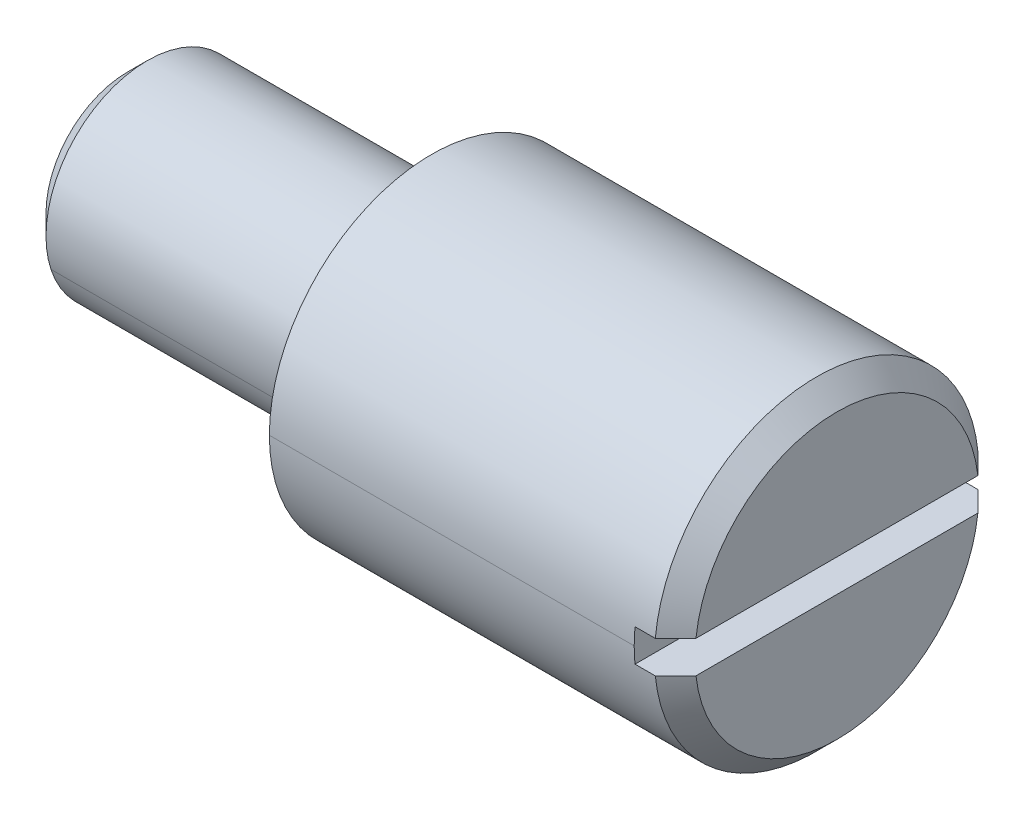
ISO-10303-21;
HEADER;
FILE_DESCRIPTION(('STEP AP214'),'2;1');
FILE_NAME('part.step','',(''),(''),'','','');
FILE_SCHEMA(('AUTOMOTIVE_DESIGN { 1 0 10303 214 1 1 1 1 }'));
ENDSEC;
DATA;
#1=APPLICATION_CONTEXT('core data for automotive mechanical design processes');
#2=APPLICATION_PROTOCOL_DEFINITION('international standard','automotive_design',2000,#1);
#3=PRODUCT_CONTEXT('',#1,'mechanical');
#4=PRODUCT('Part','Part','',(#3));
#5=PRODUCT_RELATED_PRODUCT_CATEGORY('part','',(#4));
#6=PRODUCT_DEFINITION_FORMATION('','',#4);
#7=PRODUCT_DEFINITION_CONTEXT('part definition',#1,'design');
#8=PRODUCT_DEFINITION('design','',#6,#7);
#9=PRODUCT_DEFINITION_SHAPE('','',#8);
#10=(LENGTH_UNIT() NAMED_UNIT(*) SI_UNIT(.MILLI.,.METRE.));
#11=(NAMED_UNIT(*) PLANE_ANGLE_UNIT() SI_UNIT($,.RADIAN.));
#12=(NAMED_UNIT(*) SI_UNIT($,.STERADIAN.) SOLID_ANGLE_UNIT());
#13=UNCERTAINTY_MEASURE_WITH_UNIT(LENGTH_MEASURE(1.E-05),#10,'distance_accuracy_value','');
#14=(GEOMETRIC_REPRESENTATION_CONTEXT(3) GLOBAL_UNCERTAINTY_ASSIGNED_CONTEXT((#13)) GLOBAL_UNIT_ASSIGNED_CONTEXT((#10,
#11,#12)) REPRESENTATION_CONTEXT('',''));
#15=CARTESIAN_POINT('',(0.,0.,0.));
#16=DIRECTION('',(0.,0.,1.));
#17=DIRECTION('',(1.,0.,0.));
#18=AXIS2_PLACEMENT_3D('',#15,#16,#17);
#19=CARTESIAN_POINT('',(10.,0.,0.));
#20=DIRECTION('',(1.,0.,0.));
#21=DIRECTION('',(0.,1.,0.));
#22=AXIS2_PLACEMENT_3D('',#19,#20,#21);
#23=CYLINDRICAL_SURFACE('',#22,4.);
#24=DIRECTION('',(1.,0.,0.));
#25=VECTOR('',#24,1.);
#26=CARTESIAN_POINT('',(0.,0.,4.));
#27=LINE('',#26,#25);
#28=CARTESIAN_POINT('',(0.,0.,4.));
#29=VERTEX_POINT('',#28);
#30=CARTESIAN_POINT('',(9.,0.,4.));
#31=VERTEX_POINT('',#30);
#32=EDGE_CURVE('E10',#29,#31,#27,.T.);
#33=ORIENTED_EDGE('',*,*,#32,.F.);
#34=CARTESIAN_POINT('',(0.,0.,0.));
#35=DIRECTION('',(1.,0.,0.));
#36=DIRECTION('',(0.,0.,-1.));
#37=AXIS2_PLACEMENT_3D('',#34,#35,#36);
#38=CIRCLE('',#37,4.);
#39=CARTESIAN_POINT('',(0.,0.,-4.));
#40=VERTEX_POINT('',#39);
#41=EDGE_CURVE('E24',#29,#40,#38,.T.);
#42=ORIENTED_EDGE('',*,*,#41,.T.);
#43=DIRECTION('',(1.,0.,0.));
#44=VECTOR('',#43,1.);
#45=CARTESIAN_POINT('',(0.,0.,-4.));
#46=LINE('',#45,#44);
#47=CARTESIAN_POINT('',(9.,0.,-4.));
#48=VERTEX_POINT('',#47);
#49=EDGE_CURVE('E420',#40,#48,#46,.T.);
#50=ORIENTED_EDGE('',*,*,#49,.T.);
#51=CARTESIAN_POINT('',(9.,0.,0.));
#52=DIRECTION('',(1.,0.,0.));
#53=DIRECTION('',(0.,0.,-1.));
#54=AXIS2_PLACEMENT_3D('',#51,#52,#53);
#55=CIRCLE('',#54,4.);
#56=CARTESIAN_POINT('',(9.,-0.4,-3.97994974842648));
#57=VERTEX_POINT('',#56);
#58=EDGE_CURVE('E415',#57,#48,#55,.T.);
#59=ORIENTED_EDGE('',*,*,#58,.F.);
#60=DIRECTION('',(-1.,0.,0.));
#61=VECTOR('',#60,1.);
#62=CARTESIAN_POINT('',(10.,-0.4,-3.97994974842648));
#63=LINE('',#62,#61);
#64=CARTESIAN_POINT('',(9.5,-0.4,-3.97994974842648));
#65=VERTEX_POINT('',#64);
#66=EDGE_CURVE('E411',#65,#57,#63,.T.);
#67=ORIENTED_EDGE('',*,*,#66,.F.);
#68=CARTESIAN_POINT('',(9.5,0.,0.));
#69=DIRECTION('',(1.,0.,0.));
#70=DIRECTION('',(0.,0.,-1.));
#71=AXIS2_PLACEMENT_3D('',#68,#69,#70);
#72=CIRCLE('',#71,4.);
#73=CARTESIAN_POINT('',(9.5,-0.4,3.97994974842648));
#74=VERTEX_POINT('',#73);
#75=EDGE_CURVE('E143',#74,#65,#72,.T.);
#76=ORIENTED_EDGE('',*,*,#75,.F.);
#77=DIRECTION('',(1.,0.,0.));
#78=VECTOR('',#77,1.);
#79=CARTESIAN_POINT('',(10.,-0.4,3.97994974842648));
#80=LINE('',#79,#78);
#81=CARTESIAN_POINT('',(9.,-0.4,3.97994974842648));
#82=VERTEX_POINT('',#81);
#83=EDGE_CURVE('E404',#82,#74,#80,.T.);
#84=ORIENTED_EDGE('',*,*,#83,.F.);
#85=CARTESIAN_POINT('',(9.,0.,0.));
#86=DIRECTION('',(1.,0.,0.));
#87=DIRECTION('',(0.,0.,-1.));
#88=AXIS2_PLACEMENT_3D('',#85,#86,#87);
#89=CIRCLE('',#88,4.);
#90=EDGE_CURVE('E399',#31,#82,#89,.T.);
#91=ORIENTED_EDGE('',*,*,#90,.F.);
#92=EDGE_LOOP('',(#33,#42,#50,#59,#67,#76,#84,#91));
#93=FACE_BOUND('',#92,.T.);
#94=ADVANCED_FACE('F16',(#93),#23,.T.);
#95=CARTESIAN_POINT('',(9.,0.4,8.));
#96=DIRECTION('',(1.,0.,0.));
#97=DIRECTION('',(0.,0.,-1.));
#98=AXIS2_PLACEMENT_3D('',#95,#96,#97);
#99=PLANE('',#98);
#100=CARTESIAN_POINT('',(9.,0.,0.));
#101=DIRECTION('',(1.,0.,0.));
#102=DIRECTION('',(0.,0.,-1.));
#103=AXIS2_PLACEMENT_3D('',#100,#101,#102);
#104=CIRCLE('',#103,4.);
#105=CARTESIAN_POINT('',(9.,0.4,3.97994974842648));
#106=VERTEX_POINT('',#105);
#107=EDGE_CURVE('E394',#106,#31,#104,.T.);
#108=ORIENTED_EDGE('',*,*,#107,.T.);
#109=ORIENTED_EDGE('',*,*,#90,.T.);
#110=DIRECTION('',(0.,0.,-1.));
#111=VECTOR('',#110,1.);
#112=CARTESIAN_POINT('',(9.,-0.4,8.));
#113=LINE('',#112,#111);
#114=EDGE_CURVE('E389',#82,#57,#113,.T.);
#115=ORIENTED_EDGE('',*,*,#114,.T.);
#116=ORIENTED_EDGE('',*,*,#58,.T.);
#117=CARTESIAN_POINT('',(9.,0.,0.));
#118=DIRECTION('',(1.,0.,0.));
#119=DIRECTION('',(0.,0.,-1.));
#120=AXIS2_PLACEMENT_3D('',#117,#118,#119);
#121=CIRCLE('',#120,4.);
#122=CARTESIAN_POINT('',(9.,0.4,-3.97994974842648));
#123=VERTEX_POINT('',#122);
#124=EDGE_CURVE('E385',#48,#123,#121,.T.);
#125=ORIENTED_EDGE('',*,*,#124,.T.);
#126=DIRECTION('',(0.,0.,-1.));
#127=VECTOR('',#126,1.);
#128=CARTESIAN_POINT('',(9.,0.4,8.));
#129=LINE('',#128,#127);
#130=EDGE_CURVE('E380',#106,#123,#129,.T.);
#131=ORIENTED_EDGE('',*,*,#130,.F.);
#132=EDGE_LOOP('',(#108,#109,#115,#116,#125,#131));
#133=FACE_BOUND('',#132,.T.);
#134=ADVANCED_FACE('F360',(#133),#99,.T.);
#135=CARTESIAN_POINT('',(10.,0.4,8.));
#136=DIRECTION('',(0.,-1.,0.));
#137=DIRECTION('',(0.,0.,-1.));
#138=AXIS2_PLACEMENT_3D('',#135,#136,#137);
#139=PLANE('',#138);
#140=DIRECTION('',(1.,0.,0.));
#141=VECTOR('',#140,1.);
#142=CARTESIAN_POINT('',(10.,0.4,-3.97994974842648));
#143=LINE('',#142,#141);
#144=CARTESIAN_POINT('',(9.5,0.4,-3.97994974842648));
#145=VERTEX_POINT('',#144);
#146=EDGE_CURVE('E378',#123,#145,#143,.T.);
#147=ORIENTED_EDGE('',*,*,#146,.T.);
#148=CARTESIAN_POINT('',(9.5,0.4,-3.97994974842648));
#149=CARTESIAN_POINT('',(9.66672719356399,0.4,-3.81238261406263));
#150=CARTESIAN_POINT('',(9.83340259039216,0.4,-3.64476389797192));
#151=CARTESIAN_POINT('',(10.,0.4,-3.47706773014273));
#152=B_SPLINE_CURVE_WITH_KNOTS('',3,(#148,#149,#150,#151),.UNSPECIFIED.,.F.,.F.,(4,4),(0.,1.),.UNSPECIFIED.);
#153=CARTESIAN_POINT('',(10.,0.4,-3.47706773014274));
#154=VERTEX_POINT('',#153);
#155=EDGE_CURVE('E376',#145,#154,#152,.T.);
#156=ORIENTED_EDGE('',*,*,#155,.T.);
#157=DIRECTION('',(0.,0.,1.));
#158=VECTOR('',#157,1.);
#159=CARTESIAN_POINT('',(10.,0.4,0.));
#160=LINE('',#159,#158);
#161=CARTESIAN_POINT('',(10.,0.4,3.47706773014274));
#162=VERTEX_POINT('',#161);
#163=EDGE_CURVE('E688',#154,#162,#160,.T.);
#164=ORIENTED_EDGE('',*,*,#163,.T.);
#165=CARTESIAN_POINT('',(10.,0.4,3.47706773014274));
#166=CARTESIAN_POINT('',(9.8334028568546,0.4,3.64476362975208));
#167=CARTESIAN_POINT('',(9.66672692689396,0.4,3.81238288207609));
#168=CARTESIAN_POINT('',(9.5,0.4,3.97994974842648));
#169=B_SPLINE_CURVE_WITH_KNOTS('',3,(#165,#166,#167,#168),.UNSPECIFIED.,.F.,.F.,(4,4),(0.,1.),.UNSPECIFIED.);
#170=CARTESIAN_POINT('',(9.5,0.4,3.97994974842648));
#171=VERTEX_POINT('',#170);
#172=EDGE_CURVE('E221',#162,#171,#169,.T.);
#173=ORIENTED_EDGE('',*,*,#172,.T.);
#174=DIRECTION('',(-1.,0.,0.));
#175=VECTOR('',#174,1.);
#176=CARTESIAN_POINT('',(10.,0.4,3.97994974842648));
#177=LINE('',#176,#175);
#178=EDGE_CURVE('E338',#171,#106,#177,.T.);
#179=ORIENTED_EDGE('',*,*,#178,.T.);
#180=ORIENTED_EDGE('',*,*,#130,.T.);
#181=EDGE_LOOP('',(#147,#156,#164,#173,#179,#180));
#182=FACE_BOUND('',#181,.T.);
#183=ADVANCED_FACE('F350',(#182),#139,.T.);
#184=CARTESIAN_POINT('',(10.,0.,0.));
#185=DIRECTION('',(1.,0.,0.));
#186=DIRECTION('',(0.,-1.,0.));
#187=AXIS2_PLACEMENT_3D('',#184,#185,#186);
#188=CYLINDRICAL_SURFACE('',#187,4.);
#189=ORIENTED_EDGE('',*,*,#32,.T.);
#190=ORIENTED_EDGE('',*,*,#107,.F.);
#191=ORIENTED_EDGE('',*,*,#178,.F.);
#192=CARTESIAN_POINT('',(9.5,0.,0.));
#193=DIRECTION('',(1.,0.,0.));
#194=DIRECTION('',(0.,0.,-1.));
#195=AXIS2_PLACEMENT_3D('',#192,#193,#194);
#196=CIRCLE('',#195,4.);
#197=EDGE_CURVE('E334',#145,#171,#196,.T.);
#198=ORIENTED_EDGE('',*,*,#197,.F.);
#199=ORIENTED_EDGE('',*,*,#146,.F.);
#200=ORIENTED_EDGE('',*,*,#124,.F.);
#201=ORIENTED_EDGE('',*,*,#49,.F.);
#202=CARTESIAN_POINT('',(0.,0.,0.));
#203=DIRECTION('',(1.,0.,0.));
#204=DIRECTION('',(0.,0.,-1.));
#205=AXIS2_PLACEMENT_3D('',#202,#203,#204);
#206=CIRCLE('',#205,4.);
#207=EDGE_CURVE('E330',#40,#29,#206,.T.);
#208=ORIENTED_EDGE('',*,*,#207,.T.);
#209=EDGE_LOOP('',(#189,#190,#191,#198,#199,#200,#201,#208));
#210=FACE_BOUND('',#209,.T.);
#211=ADVANCED_FACE('F359',(#210),#188,.T.);
#212=CARTESIAN_POINT('',(0.,0.,0.));
#213=DIRECTION('',(1.,0.,0.));
#214=DIRECTION('',(0.,0.,-1.));
#215=AXIS2_PLACEMENT_3D('',#212,#213,#214);
#216=PLANE('',#215);
#217=ORIENTED_EDGE('',*,*,#41,.F.);
#218=ORIENTED_EDGE('',*,*,#207,.F.);
#219=EDGE_LOOP('',(#217,#218));
#220=FACE_BOUND('',#219,.T.);
#221=CARTESIAN_POINT('',(0.,0.,0.));
#222=DIRECTION('',(1.,0.,0.));
#223=DIRECTION('',(0.,0.,-1.));
#224=AXIS2_PLACEMENT_3D('',#221,#222,#223);
#225=CIRCLE('',#224,2.0095);
#226=CARTESIAN_POINT('',(0.,0.,-2.0095));
#227=VERTEX_POINT('',#226);
#228=CARTESIAN_POINT('',(0.,0.,2.0095));
#229=VERTEX_POINT('',#228);
#230=EDGE_CURVE('E326',#227,#229,#225,.T.);
#231=ORIENTED_EDGE('',*,*,#230,.T.);
#232=CARTESIAN_POINT('',(0.,0.,0.));
#233=DIRECTION('',(1.,0.,0.));
#234=DIRECTION('',(0.,0.,-1.));
#235=AXIS2_PLACEMENT_3D('',#232,#233,#234);
#236=CIRCLE('',#235,2.0095);
#237=EDGE_CURVE('E322',#229,#227,#236,.T.);
#238=ORIENTED_EDGE('',*,*,#237,.T.);
#239=EDGE_LOOP('',(#231,#238));
#240=FACE_BOUND('',#239,.T.);
#241=ADVANCED_FACE('F438',(#220,#240),#216,.F.);
#242=CARTESIAN_POINT('',(0.,0.,0.));
#243=DIRECTION('',(1.,0.,0.));
#244=DIRECTION('',(0.,1.,0.));
#245=AXIS2_PLACEMENT_3D('',#242,#243,#244);
#246=CYLINDRICAL_SURFACE('',#245,2.0095);
#247=DIRECTION('',(1.,0.,0.));
#248=VECTOR('',#247,1.);
#249=CARTESIAN_POINT('',(-0.5,0.,2.0095));
#250=LINE('',#249,#248);
#251=CARTESIAN_POINT('',(-0.5,0.,2.0095));
#252=VERTEX_POINT('',#251);
#253=EDGE_CURVE('E317',#252,#229,#250,.T.);
#254=ORIENTED_EDGE('',*,*,#253,.F.);
#255=CARTESIAN_POINT('',(-0.5,0.,0.));
#256=DIRECTION('',(1.,0.,0.));
#257=DIRECTION('',(0.,0.,-1.));
#258=AXIS2_PLACEMENT_3D('',#255,#256,#257);
#259=CIRCLE('',#258,2.0095);
#260=CARTESIAN_POINT('',(-0.5,0.,-2.0095));
#261=VERTEX_POINT('',#260);
#262=EDGE_CURVE('E313',#252,#261,#259,.T.);
#263=ORIENTED_EDGE('',*,*,#262,.T.);
#264=DIRECTION('',(1.,0.,0.));
#265=VECTOR('',#264,1.);
#266=CARTESIAN_POINT('',(-0.5,0.,-2.0095));
#267=LINE('',#266,#265);
#268=EDGE_CURVE('E308',#261,#227,#267,.T.);
#269=ORIENTED_EDGE('',*,*,#268,.T.);
#270=ORIENTED_EDGE('',*,*,#237,.F.);
#271=EDGE_LOOP('',(#254,#263,#269,#270));
#272=FACE_BOUND('',#271,.T.);
#273=ADVANCED_FACE('F441',(#272),#246,.T.);
#274=CARTESIAN_POINT('',(0.,0.,0.));
#275=DIRECTION('',(1.,0.,0.));
#276=DIRECTION('',(0.,-1.,0.));
#277=AXIS2_PLACEMENT_3D('',#274,#275,#276);
#278=CYLINDRICAL_SURFACE('',#277,2.0095);
#279=ORIENTED_EDGE('',*,*,#253,.T.);
#280=ORIENTED_EDGE('',*,*,#230,.F.);
#281=ORIENTED_EDGE('',*,*,#268,.F.);
#282=CARTESIAN_POINT('',(-0.5,0.,0.));
#283=DIRECTION('',(1.,0.,0.));
#284=DIRECTION('',(0.,0.,-1.));
#285=AXIS2_PLACEMENT_3D('',#282,#283,#284);
#286=CIRCLE('',#285,2.0095);
#287=EDGE_CURVE('E303',#261,#252,#286,.T.);
#288=ORIENTED_EDGE('',*,*,#287,.T.);
#289=EDGE_LOOP('',(#279,#280,#281,#288));
#290=FACE_BOUND('',#289,.T.);
#291=ADVANCED_FACE('F447',(#290),#278,.T.);
#292=CARTESIAN_POINT('',(-0.9905,0.,0.));
#293=DIRECTION('',(-1.,0.,0.));
#294=DIRECTION('',(0.,-1.,0.));
#295=AXIS2_PLACEMENT_3D('',#292,#293,#294);
#296=CONICAL_SURFACE('',#295,2.5,0.785398163397448);
#297=DIRECTION('',(-0.707106781186548,0.,-0.707106781186547));
#298=VECTOR('',#297,1.);
#299=CARTESIAN_POINT('',(-0.5,0.,-2.0095));
#300=LINE('',#299,#298);
#301=CARTESIAN_POINT('',(-0.9905,0.,-2.5));
#302=VERTEX_POINT('',#301);
#303=EDGE_CURVE('E299',#261,#302,#300,.T.);
#304=ORIENTED_EDGE('',*,*,#303,.T.);
#305=CARTESIAN_POINT('',(-0.9905,0.,0.));
#306=DIRECTION('',(1.,0.,0.));
#307=DIRECTION('',(0.,0.,-1.));
#308=AXIS2_PLACEMENT_3D('',#305,#306,#307);
#309=CIRCLE('',#308,2.5);
#310=CARTESIAN_POINT('',(-0.9905,0.,2.5));
#311=VERTEX_POINT('',#310);
#312=EDGE_CURVE('E295',#302,#311,#309,.T.);
#313=ORIENTED_EDGE('',*,*,#312,.T.);
#314=DIRECTION('',(-0.707106781186548,0.,0.707106781186547));
#315=VECTOR('',#314,1.);
#316=CARTESIAN_POINT('',(-0.5,0.,2.0095));
#317=LINE('',#316,#315);
#318=EDGE_CURVE('E290',#252,#311,#317,.T.);
#319=ORIENTED_EDGE('',*,*,#318,.F.);
#320=ORIENTED_EDGE('',*,*,#287,.F.);
#321=EDGE_LOOP('',(#304,#313,#319,#320));
#322=FACE_BOUND('',#321,.T.);
#323=ADVANCED_FACE('F452',(#322),#296,.T.);
#324=CARTESIAN_POINT('',(-0.9905,0.,0.));
#325=DIRECTION('',(-1.,0.,0.));
#326=DIRECTION('',(0.,1.,0.));
#327=AXIS2_PLACEMENT_3D('',#324,#325,#326);
#328=CONICAL_SURFACE('',#327,2.5,0.785398163397448);
#329=ORIENTED_EDGE('',*,*,#303,.F.);
#330=ORIENTED_EDGE('',*,*,#262,.F.);
#331=ORIENTED_EDGE('',*,*,#318,.T.);
#332=CARTESIAN_POINT('',(-0.9905,0.,0.));
#333=DIRECTION('',(1.,0.,0.));
#334=DIRECTION('',(0.,0.,-1.));
#335=AXIS2_PLACEMENT_3D('',#332,#333,#334);
#336=CIRCLE('',#335,2.5);
#337=CARTESIAN_POINT('',(-0.990500000000001,-0.772542485937367,2.37764129073788));
#338=VERTEX_POINT('',#337);
#339=EDGE_CURVE('E286',#311,#338,#336,.T.);
#340=ORIENTED_EDGE('',*,*,#339,.T.);
#341=CARTESIAN_POINT('',(-0.9905,0.,0.));
#342=DIRECTION('',(1.,0.,0.));
#343=DIRECTION('',(0.,0.,-1.));
#344=AXIS2_PLACEMENT_3D('',#341,#342,#343);
#345=CIRCLE('',#344,2.5);
#346=EDGE_CURVE('E281',#338,#302,#345,.T.);
#347=ORIENTED_EDGE('',*,*,#346,.T.);
#348=EDGE_LOOP('',(#329,#330,#331,#340,#347));
#349=FACE_BOUND('',#348,.T.);
#350=ADVANCED_FACE('F457',(#349),#328,.T.);
#351=CARTESIAN_POINT('',(0.,0.,0.));
#352=DIRECTION('',(1.,0.,0.));
#353=DIRECTION('',(0.,0.987688340595138,0.156434465040231));
#354=AXIS2_PLACEMENT_3D('',#351,#352,#353);
#355=CYLINDRICAL_SURFACE('',#354,2.5);
#356=DIRECTION('',(1.,0.,0.));
#357=VECTOR('',#356,1.);
#358=CARTESIAN_POINT('',(-7.0095,-0.772542485937367,2.37764129073788));
#359=LINE('',#358,#357);
#360=CARTESIAN_POINT('',(-7.0095,-0.772542485937367,2.37764129073788));
#361=VERTEX_POINT('',#360);
#362=EDGE_CURVE('E276',#361,#338,#359,.T.);
#363=ORIENTED_EDGE('',*,*,#362,.F.);
#364=CARTESIAN_POINT('',(-7.0095,0.,0.));
#365=DIRECTION('',(1.,0.,0.));
#366=DIRECTION('',(0.,0.,-1.));
#367=AXIS2_PLACEMENT_3D('',#364,#365,#366);
#368=CIRCLE('',#367,2.5);
#369=CARTESIAN_POINT('',(-7.0095,0.,-2.5));
#370=VERTEX_POINT('',#369);
#371=EDGE_CURVE('E272',#361,#370,#368,.T.);
#372=ORIENTED_EDGE('',*,*,#371,.T.);
#373=DIRECTION('',(1.,0.,0.));
#374=VECTOR('',#373,1.);
#375=CARTESIAN_POINT('',(-7.0095,0.,-2.5));
#376=LINE('',#375,#374);
#377=EDGE_CURVE('E267',#370,#302,#376,.T.);
#378=ORIENTED_EDGE('',*,*,#377,.T.);
#379=ORIENTED_EDGE('',*,*,#346,.F.);
#380=EDGE_LOOP('',(#363,#372,#378,#379));
#381=FACE_BOUND('',#380,.T.);
#382=ADVANCED_FACE('F461',(#381),#355,.T.);
#383=CARTESIAN_POINT('',(0.,0.,0.));
#384=DIRECTION('',(1.,0.,0.));
#385=DIRECTION('',(0.,-0.987688340595138,-0.156434465040231));
#386=AXIS2_PLACEMENT_3D('',#383,#384,#385);
#387=CYLINDRICAL_SURFACE('',#386,2.5);
#388=ORIENTED_EDGE('',*,*,#362,.T.);
#389=ORIENTED_EDGE('',*,*,#339,.F.);
#390=ORIENTED_EDGE('',*,*,#312,.F.);
#391=ORIENTED_EDGE('',*,*,#377,.F.);
#392=CARTESIAN_POINT('',(-7.0095,0.,0.));
#393=DIRECTION('',(1.,0.,0.));
#394=DIRECTION('',(0.,0.,-1.));
#395=AXIS2_PLACEMENT_3D('',#392,#393,#394);
#396=CIRCLE('',#395,2.5);
#397=CARTESIAN_POINT('',(-7.0095,0.,2.5));
#398=VERTEX_POINT('',#397);
#399=EDGE_CURVE('E263',#370,#398,#396,.T.);
#400=ORIENTED_EDGE('',*,*,#399,.T.);
#401=CARTESIAN_POINT('',(-7.0095,0.,0.));
#402=DIRECTION('',(1.,0.,0.));
#403=DIRECTION('',(0.,0.,-1.));
#404=AXIS2_PLACEMENT_3D('',#401,#402,#403);
#405=CIRCLE('',#404,2.5);
#406=EDGE_CURVE('E258',#398,#361,#405,.T.);
#407=ORIENTED_EDGE('',*,*,#406,.T.);
#408=EDGE_LOOP('',(#388,#389,#390,#391,#400,#407));
#409=FACE_BOUND('',#408,.T.);
#410=ADVANCED_FACE('F464',(#409),#387,.T.);
#411=CARTESIAN_POINT('',(-7.5,0.,0.));
#412=DIRECTION('',(1.,0.,0.));
#413=DIRECTION('',(0.,1.,0.));
#414=AXIS2_PLACEMENT_3D('',#411,#412,#413);
#415=CONICAL_SURFACE('',#414,2.0095,0.785398163397449);
#416=DIRECTION('',(0.707106781186547,0.,0.707106781186548));
#417=VECTOR('',#416,1.);
#418=CARTESIAN_POINT('',(-7.5,0.,2.0095));
#419=LINE('',#418,#417);
#420=CARTESIAN_POINT('',(-7.5,0.,2.0095));
#421=VERTEX_POINT('',#420);
#422=EDGE_CURVE('E253',#421,#398,#419,.T.);
#423=ORIENTED_EDGE('',*,*,#422,.F.);
#424=CARTESIAN_POINT('',(-7.5,0.,0.));
#425=DIRECTION('',(1.,0.,0.));
#426=DIRECTION('',(0.,0.,-1.));
#427=AXIS2_PLACEMENT_3D('',#424,#425,#426);
#428=CIRCLE('',#427,2.0095);
#429=CARTESIAN_POINT('',(-7.5,0.,-2.0095));
#430=VERTEX_POINT('',#429);
#431=EDGE_CURVE('E249',#421,#430,#428,.T.);
#432=ORIENTED_EDGE('',*,*,#431,.T.);
#433=DIRECTION('',(0.707106781186547,0.,-0.707106781186548));
#434=VECTOR('',#433,1.);
#435=CARTESIAN_POINT('',(-7.5,0.,-2.0095));
#436=LINE('',#435,#434);
#437=EDGE_CURVE('E244',#430,#370,#436,.T.);
#438=ORIENTED_EDGE('',*,*,#437,.T.);
#439=ORIENTED_EDGE('',*,*,#371,.F.);
#440=ORIENTED_EDGE('',*,*,#406,.F.);
#441=EDGE_LOOP('',(#423,#432,#438,#439,#440));
#442=FACE_BOUND('',#441,.T.);
#443=ADVANCED_FACE('F468',(#442),#415,.T.);
#444=CARTESIAN_POINT('',(-7.5,0.,0.));
#445=DIRECTION('',(1.,0.,0.));
#446=DIRECTION('',(0.,-1.,0.));
#447=AXIS2_PLACEMENT_3D('',#444,#445,#446);
#448=CONICAL_SURFACE('',#447,2.0095,0.785398163397449);
#449=ORIENTED_EDGE('',*,*,#422,.T.);
#450=ORIENTED_EDGE('',*,*,#399,.F.);
#451=ORIENTED_EDGE('',*,*,#437,.F.);
#452=CARTESIAN_POINT('',(-7.5,0.,0.));
#453=DIRECTION('',(1.,0.,0.));
#454=DIRECTION('',(0.,0.,-1.));
#455=AXIS2_PLACEMENT_3D('',#452,#453,#454);
#456=CIRCLE('',#455,2.0095);
#457=EDGE_CURVE('E239',#430,#421,#456,.T.);
#458=ORIENTED_EDGE('',*,*,#457,.T.);
#459=EDGE_LOOP('',(#449,#450,#451,#458));
#460=FACE_BOUND('',#459,.T.);
#461=ADVANCED_FACE('F473',(#460),#448,.T.);
#462=CARTESIAN_POINT('',(-7.5,0.49999520497701,0.));
#463=DIRECTION('',(1.,0.,0.));
#464=DIRECTION('',(0.,0.,-1.));
#465=AXIS2_PLACEMENT_3D('',#462,#463,#464);
#466=PLANE('',#465);
#467=ORIENTED_EDGE('',*,*,#431,.F.);
#468=ORIENTED_EDGE('',*,*,#457,.F.);
#469=EDGE_LOOP('',(#467,#468));
#470=FACE_BOUND('',#469,.T.);
#471=CARTESIAN_POINT('',(-7.5,0.,0.));
#472=DIRECTION('',(1.,0.,0.));
#473=DIRECTION('',(0.,0.,-1.));
#474=AXIS2_PLACEMENT_3D('',#471,#472,#473);
#475=CIRCLE('',#474,0.49999520497701);
#476=CARTESIAN_POINT('',(-7.5,0.,-0.49999520497701));
#477=VERTEX_POINT('',#476);
#478=CARTESIAN_POINT('',(-7.5,0.,0.49999520497701));
#479=VERTEX_POINT('',#478);
#480=EDGE_CURVE('E235',#477,#479,#475,.T.);
#481=ORIENTED_EDGE('',*,*,#480,.T.);
#482=CARTESIAN_POINT('',(-7.5,0.,0.));
#483=DIRECTION('',(1.,0.,0.));
#484=DIRECTION('',(0.,0.,-1.));
#485=AXIS2_PLACEMENT_3D('',#482,#483,#484);
#486=CIRCLE('',#485,0.49999520497701);
#487=EDGE_CURVE('E231',#479,#477,#486,.T.);
#488=ORIENTED_EDGE('',*,*,#487,.T.);
#489=EDGE_LOOP('',(#481,#488));
#490=FACE_BOUND('',#489,.T.);
#491=ADVANCED_FACE('F475',(#470,#490),#466,.F.);
#492=CARTESIAN_POINT('',(-7.000004795023,0.,0.));
#493=DIRECTION('',(-1.,0.,0.));
#494=DIRECTION('',(0.,1.,0.));
#495=AXIS2_PLACEMENT_3D('',#492,#493,#494);
#496=CONICAL_SURFACE('',#495,0.,0.785398163397459);
#497=DIRECTION('',(-0.70710678118654,0.,-0.707106781186555));
#498=VECTOR('',#497,1.);
#499=CARTESIAN_POINT('',(-7.000004795023,0.,0.));
#500=LINE('',#499,#498);
#501=CARTESIAN_POINT('',(-7.000004795023,0.,0.));
#502=VERTEX_POINT('',#501);
#503=EDGE_CURVE('E225',#502,#477,#500,.T.);
#504=ORIENTED_EDGE('',*,*,#503,.T.);
#505=ORIENTED_EDGE('',*,*,#487,.F.);
#506=DIRECTION('',(-0.70710678118654,0.,0.707106781186555));
#507=VECTOR('',#506,1.);
#508=CARTESIAN_POINT('',(-7.000004795023,0.,0.));
#509=LINE('',#508,#507);
#510=EDGE_CURVE('E222',#502,#479,#509,.T.);
#511=ORIENTED_EDGE('',*,*,#510,.F.);
#512=EDGE_LOOP('',(#504,#505,#511));
#513=FACE_BOUND('',#512,.T.);
#514=ADVANCED_FACE('F478',(#513),#496,.F.);
#515=CARTESIAN_POINT('',(-7.000004795023,0.,0.));
#516=DIRECTION('',(-1.,0.,0.));
#517=DIRECTION('',(0.,-1.,0.));
#518=AXIS2_PLACEMENT_3D('',#515,#516,#517);
#519=CONICAL_SURFACE('',#518,0.,0.785398163397459);
#520=ORIENTED_EDGE('',*,*,#510,.T.);
#521=ORIENTED_EDGE('',*,*,#480,.F.);
#522=ORIENTED_EDGE('',*,*,#503,.F.);
#523=EDGE_LOOP('',(#520,#521,#522));
#524=FACE_BOUND('',#523,.T.);
#525=ADVANCED_FACE('F202',(#524),#519,.F.);
#526=CARTESIAN_POINT('',(9.5,0.,0.));
#527=DIRECTION('',(-1.,0.,0.));
#528=DIRECTION('',(0.,-1.,0.));
#529=AXIS2_PLACEMENT_3D('',#526,#527,#528);
#530=CONICAL_SURFACE('',#529,4.,0.785398163397448);
#531=ORIENTED_EDGE('',*,*,#172,.F.);
#532=CARTESIAN_POINT('',(10.,0.,0.));
#533=DIRECTION('',(1.,0.,0.));
#534=DIRECTION('',(0.,0.,-1.));
#535=AXIS2_PLACEMENT_3D('',#532,#533,#534);
#536=CIRCLE('',#535,3.5);
#537=EDGE_CURVE('E226',#154,#162,#536,.T.);
#538=ORIENTED_EDGE('',*,*,#537,.F.);
#539=ORIENTED_EDGE('',*,*,#155,.F.);
#540=ORIENTED_EDGE('',*,*,#197,.T.);
#541=EDGE_LOOP('',(#531,#538,#539,#540));
#542=FACE_BOUND('',#541,.T.);
#543=ADVANCED_FACE('F193',(#542),#530,.T.);
#544=CARTESIAN_POINT('',(10.,3.5,0.));
#545=DIRECTION('',(-1.,0.,0.));
#546=DIRECTION('',(0.,0.,1.));
#547=AXIS2_PLACEMENT_3D('',#544,#545,#546);
#548=PLANE('',#547);
#549=ORIENTED_EDGE('',*,*,#163,.F.);
#550=ORIENTED_EDGE('',*,*,#537,.T.);
#551=EDGE_LOOP('',(#549,#550));
#552=FACE_BOUND('',#551,.T.);
#553=ADVANCED_FACE('F167',(#552),#548,.F.);
#554=CARTESIAN_POINT('',(9.,-0.4,8.));
#555=DIRECTION('',(0.,1.,0.));
#556=DIRECTION('',(0.,0.,1.));
#557=AXIS2_PLACEMENT_3D('',#554,#555,#556);
#558=PLANE('',#557);
#559=ORIENTED_EDGE('',*,*,#83,.T.);
#560=CARTESIAN_POINT('',(9.5,-0.4,3.97994974842648));
#561=CARTESIAN_POINT('',(9.66672719356398,-0.4,3.81238261406263));
#562=CARTESIAN_POINT('',(9.83340259039216,-0.4,3.64476389797192));
#563=CARTESIAN_POINT('',(10.,-0.4,3.47706773014274));
#564=B_SPLINE_CURVE_WITH_KNOTS('',3,(#560,#561,#562,#563),.UNSPECIFIED.,.F.,.F.,(4,4),(0.,1.),.UNSPECIFIED.);
#565=CARTESIAN_POINT('',(10.,-0.4,3.47706773014274));
#566=VERTEX_POINT('',#565);
#567=EDGE_CURVE('E132',#74,#566,#564,.T.);
#568=ORIENTED_EDGE('',*,*,#567,.T.);
#569=DIRECTION('',(0.,0.,-1.));
#570=VECTOR('',#569,1.);
#571=CARTESIAN_POINT('',(10.,-0.4,0.));
#572=LINE('',#571,#570);
#573=CARTESIAN_POINT('',(10.,-0.4,-3.47706773014274));
#574=VERTEX_POINT('',#573);
#575=EDGE_CURVE('E122',#566,#574,#572,.T.);
#576=ORIENTED_EDGE('',*,*,#575,.T.);
#577=CARTESIAN_POINT('',(10.,-0.4,-3.47706773014274));
#578=CARTESIAN_POINT('',(9.8334028568546,-0.4,-3.64476362975208));
#579=CARTESIAN_POINT('',(9.66672692689396,-0.4,-3.81238288207609));
#580=CARTESIAN_POINT('',(9.5,-0.4,-3.97994974842647));
#581=B_SPLINE_CURVE_WITH_KNOTS('',3,(#577,#578,#579,#580),.UNSPECIFIED.,.F.,.F.,(4,4),(0.,1.),.UNSPECIFIED.);
#582=EDGE_CURVE('E128',#574,#65,#581,.T.);
#583=ORIENTED_EDGE('',*,*,#582,.T.);
#584=ORIENTED_EDGE('',*,*,#66,.T.);
#585=ORIENTED_EDGE('',*,*,#114,.F.);
#586=EDGE_LOOP('',(#559,#568,#576,#583,#584,#585));
#587=FACE_BOUND('',#586,.T.);
#588=ADVANCED_FACE('F125',(#587),#558,.T.);
#589=CARTESIAN_POINT('',(9.5,0.,0.));
#590=DIRECTION('',(-1.,0.,0.));
#591=DIRECTION('',(0.,1.,0.));
#592=AXIS2_PLACEMENT_3D('',#589,#590,#591);
#593=CONICAL_SURFACE('',#592,4.,0.785398163397448);
#594=ORIENTED_EDGE('',*,*,#567,.F.);
#595=ORIENTED_EDGE('',*,*,#75,.T.);
#596=ORIENTED_EDGE('',*,*,#582,.F.);
#597=CARTESIAN_POINT('',(10.,0.,0.));
#598=DIRECTION('',(1.,0.,0.));
#599=DIRECTION('',(0.,0.,-1.));
#600=AXIS2_PLACEMENT_3D('',#597,#598,#599);
#601=CIRCLE('',#600,3.5);
#602=EDGE_CURVE('E137',#566,#574,#601,.T.);
#603=ORIENTED_EDGE('',*,*,#602,.F.);
#604=EDGE_LOOP('',(#594,#595,#596,#603));
#605=FACE_BOUND('',#604,.T.);
#606=ADVANCED_FACE('F142',(#605),#593,.T.);
#607=CARTESIAN_POINT('',(10.,3.5,0.));
#608=DIRECTION('',(-1.,0.,0.));
#609=DIRECTION('',(0.,0.,1.));
#610=AXIS2_PLACEMENT_3D('',#607,#608,#609);
#611=PLANE('',#610);
#612=ORIENTED_EDGE('',*,*,#575,.F.);
#613=ORIENTED_EDGE('',*,*,#602,.T.);
#614=EDGE_LOOP('',(#612,#613));
#615=FACE_BOUND('',#614,.T.);
#616=ADVANCED_FACE('F138',(#615),#611,.F.);
#617=CLOSED_SHELL('',(#94,#134,#183,#211,#241,#273,#291,#323,#350,#382,#410,#443,#461,#491,#514,
#525,#543,#553,#588,#606,#616));
#618=MANIFOLD_SOLID_BREP('B1',#617);
#619=ADVANCED_BREP_SHAPE_REPRESENTATION('',(#18,#618),#14);
#620=SHAPE_DEFINITION_REPRESENTATION(#9,#619);
ENDSEC;
END-ISO-10303-21;
